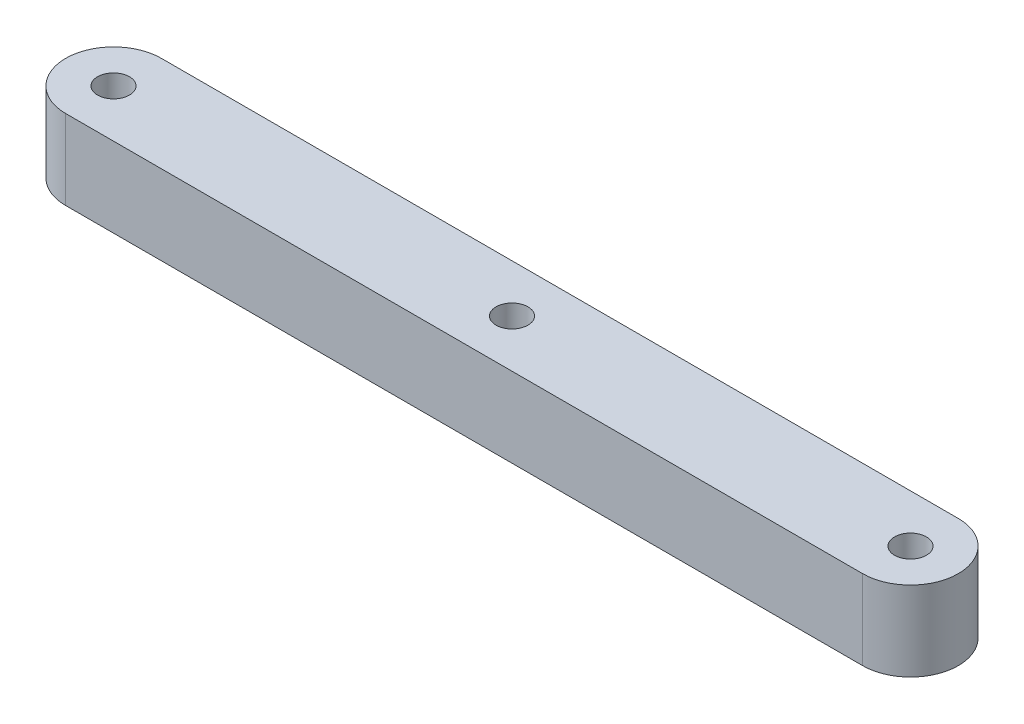
ISO-10303-21;
HEADER;
FILE_DESCRIPTION(('STEP AP214'),'2;1');
FILE_NAME('part.step','',(''),(''),'','','');
FILE_SCHEMA(('AUTOMOTIVE_DESIGN { 1 0 10303 214 1 1 1 1 }'));
ENDSEC;
DATA;
#1=APPLICATION_CONTEXT('core data for automotive mechanical design processes');
#2=APPLICATION_PROTOCOL_DEFINITION('international standard','automotive_design',2000,#1);
#3=PRODUCT_CONTEXT('',#1,'mechanical');
#4=PRODUCT('Part','Part','',(#3));
#5=PRODUCT_RELATED_PRODUCT_CATEGORY('part','',(#4));
#6=PRODUCT_DEFINITION_FORMATION('','',#4);
#7=PRODUCT_DEFINITION_CONTEXT('part definition',#1,'design');
#8=PRODUCT_DEFINITION('design','',#6,#7);
#9=PRODUCT_DEFINITION_SHAPE('','',#8);
#10=(LENGTH_UNIT() NAMED_UNIT(*) SI_UNIT(.MILLI.,.METRE.));
#11=(NAMED_UNIT(*) PLANE_ANGLE_UNIT() SI_UNIT($,.RADIAN.));
#12=(NAMED_UNIT(*) SI_UNIT($,.STERADIAN.) SOLID_ANGLE_UNIT());
#13=UNCERTAINTY_MEASURE_WITH_UNIT(LENGTH_MEASURE(1.E-05),#10,'distance_accuracy_value','');
#14=(GEOMETRIC_REPRESENTATION_CONTEXT(3) GLOBAL_UNCERTAINTY_ASSIGNED_CONTEXT((#13)) GLOBAL_UNIT_ASSIGNED_CONTEXT((#10,
#11,#12)) REPRESENTATION_CONTEXT('',''));
#15=CARTESIAN_POINT('',(0.,0.,0.));
#16=DIRECTION('',(0.,0.,1.));
#17=DIRECTION('',(1.,0.,0.));
#18=AXIS2_PLACEMENT_3D('',#15,#16,#17);
#19=CARTESIAN_POINT('',(-63.5,12.7,0.));
#20=DIRECTION('',(0.,-1.,0.));
#21=DIRECTION('',(0.,0.,-1.));
#22=AXIS2_PLACEMENT_3D('',#19,#20,#21);
#23=CYLINDRICAL_SURFACE('',#22,7.62);
#24=CARTESIAN_POINT('',(-63.5,0.,0.));
#25=DIRECTION('',(0.,1.,0.));
#26=DIRECTION('',(0.,0.,1.));
#27=AXIS2_PLACEMENT_3D('',#24,#25,#26);
#28=CIRCLE('',#27,7.62);
#29=CARTESIAN_POINT('',(-63.5,0.,-7.62));
#30=VERTEX_POINT('',#29);
#31=CARTESIAN_POINT('',(-63.5,0.,7.62));
#32=VERTEX_POINT('',#31);
#33=EDGE_CURVE('E102',#30,#32,#28,.T.);
#34=ORIENTED_EDGE('',*,*,#33,.T.);
#35=DIRECTION('',(0.,-1.,0.));
#36=VECTOR('',#35,1.);
#37=CARTESIAN_POINT('',(-63.5,12.7,7.62));
#38=LINE('',#37,#36);
#39=CARTESIAN_POINT('',(-63.5,12.7,7.62));
#40=VERTEX_POINT('',#39);
#41=EDGE_CURVE('E11',#40,#32,#38,.T.);
#42=ORIENTED_EDGE('',*,*,#41,.F.);
#43=CARTESIAN_POINT('',(-63.5,12.7,0.));
#44=DIRECTION('',(0.,1.,0.));
#45=DIRECTION('',(0.,0.,1.));
#46=AXIS2_PLACEMENT_3D('',#43,#44,#45);
#47=CIRCLE('',#46,7.62);
#48=CARTESIAN_POINT('',(-63.5,12.7,-7.62));
#49=VERTEX_POINT('',#48);
#50=EDGE_CURVE('E90',#49,#40,#47,.T.);
#51=ORIENTED_EDGE('',*,*,#50,.F.);
#52=DIRECTION('',(0.,-1.,0.));
#53=VECTOR('',#52,1.);
#54=CARTESIAN_POINT('',(-63.5,12.7,-7.62));
#55=LINE('',#54,#53);
#56=EDGE_CURVE('E98',#49,#30,#55,.T.);
#57=ORIENTED_EDGE('',*,*,#56,.T.);
#58=EDGE_LOOP('',(#34,#42,#51,#57));
#59=FACE_BOUND('',#58,.T.);
#60=ADVANCED_FACE('F39',(#59),#23,.T.);
#61=CARTESIAN_POINT('',(-63.5,12.7,7.62));
#62=DIRECTION('',(0.,0.,-1.));
#63=DIRECTION('',(-1.,0.,0.));
#64=AXIS2_PLACEMENT_3D('',#61,#62,#63);
#65=PLANE('',#64);
#66=DIRECTION('',(1.,0.,0.));
#67=VECTOR('',#66,1.);
#68=CARTESIAN_POINT('',(-63.5,0.,7.62));
#69=LINE('',#68,#67);
#70=CARTESIAN_POINT('',(63.5,0.,7.62));
#71=VERTEX_POINT('',#70);
#72=EDGE_CURVE('E94',#32,#71,#69,.T.);
#73=ORIENTED_EDGE('',*,*,#72,.T.);
#74=DIRECTION('',(0.,-1.,0.));
#75=VECTOR('',#74,1.);
#76=CARTESIAN_POINT('',(63.5,12.7,7.62));
#77=LINE('',#76,#75);
#78=CARTESIAN_POINT('',(63.5,12.7,7.62));
#79=VERTEX_POINT('',#78);
#80=EDGE_CURVE('E47',#79,#71,#77,.T.);
#81=ORIENTED_EDGE('',*,*,#80,.F.);
#82=DIRECTION('',(1.,0.,0.));
#83=VECTOR('',#82,1.);
#84=CARTESIAN_POINT('',(-63.5,12.7,7.62));
#85=LINE('',#84,#83);
#86=EDGE_CURVE('E85',#40,#79,#85,.T.);
#87=ORIENTED_EDGE('',*,*,#86,.F.);
#88=ORIENTED_EDGE('',*,*,#41,.T.);
#89=EDGE_LOOP('',(#73,#81,#87,#88));
#90=FACE_BOUND('',#89,.T.);
#91=ADVANCED_FACE('F93',(#90),#65,.F.);
#92=CARTESIAN_POINT('',(63.5,12.7,0.));
#93=DIRECTION('',(0.,-1.,0.));
#94=DIRECTION('',(0.,0.,-1.));
#95=AXIS2_PLACEMENT_3D('',#92,#93,#94);
#96=CYLINDRICAL_SURFACE('',#95,7.62);
#97=CARTESIAN_POINT('',(63.5,0.,0.));
#98=DIRECTION('',(0.,1.,0.));
#99=DIRECTION('',(0.,0.,1.));
#100=AXIS2_PLACEMENT_3D('',#97,#98,#99);
#101=CIRCLE('',#100,7.62);
#102=CARTESIAN_POINT('',(63.5,0.,-7.62));
#103=VERTEX_POINT('',#102);
#104=EDGE_CURVE('E72',#71,#103,#101,.T.);
#105=ORIENTED_EDGE('',*,*,#104,.T.);
#106=DIRECTION('',(0.,-1.,0.));
#107=VECTOR('',#106,1.);
#108=CARTESIAN_POINT('',(63.5,12.7,-7.62));
#109=LINE('',#108,#107);
#110=CARTESIAN_POINT('',(63.5,12.7,-7.62));
#111=VERTEX_POINT('',#110);
#112=EDGE_CURVE('E95',#111,#103,#109,.T.);
#113=ORIENTED_EDGE('',*,*,#112,.F.);
#114=CARTESIAN_POINT('',(63.5,12.7,0.));
#115=DIRECTION('',(0.,1.,0.));
#116=DIRECTION('',(0.,0.,1.));
#117=AXIS2_PLACEMENT_3D('',#114,#115,#116);
#118=CIRCLE('',#117,7.62);
#119=EDGE_CURVE('E88',#79,#111,#118,.T.);
#120=ORIENTED_EDGE('',*,*,#119,.F.);
#121=ORIENTED_EDGE('',*,*,#80,.T.);
#122=EDGE_LOOP('',(#105,#113,#120,#121));
#123=FACE_BOUND('',#122,.T.);
#124=ADVANCED_FACE('F96',(#123),#96,.T.);
#125=CARTESIAN_POINT('',(-63.5,12.7,-7.62));
#126=DIRECTION('',(0.,0.,1.));
#127=DIRECTION('',(1.,0.,0.));
#128=AXIS2_PLACEMENT_3D('',#125,#126,#127);
#129=PLANE('',#128);
#130=DIRECTION('',(-1.,0.,0.));
#131=VECTOR('',#130,1.);
#132=CARTESIAN_POINT('',(-63.5,0.,-7.62));
#133=LINE('',#132,#131);
#134=EDGE_CURVE('E78',#103,#30,#133,.T.);
#135=ORIENTED_EDGE('',*,*,#134,.T.);
#136=ORIENTED_EDGE('',*,*,#56,.F.);
#137=DIRECTION('',(-1.,0.,0.));
#138=VECTOR('',#137,1.);
#139=CARTESIAN_POINT('',(-63.5,12.7,-7.62));
#140=LINE('',#139,#138);
#141=EDGE_CURVE('E55',#111,#49,#140,.T.);
#142=ORIENTED_EDGE('',*,*,#141,.F.);
#143=ORIENTED_EDGE('',*,*,#112,.T.);
#144=EDGE_LOOP('',(#135,#136,#142,#143));
#145=FACE_BOUND('',#144,.T.);
#146=ADVANCED_FACE('F110',(#145),#129,.F.);
#147=CARTESIAN_POINT('',(-63.5,12.7,0.));
#148=DIRECTION('',(0.,1.,0.));
#149=DIRECTION('',(0.,0.,1.));
#150=AXIS2_PLACEMENT_3D('',#147,#148,#149);
#151=PLANE('',#150);
#152=CARTESIAN_POINT('',(-63.5,12.7,0.));
#153=DIRECTION('',(0.,1.,0.));
#154=DIRECTION('',(0.,0.,1.));
#155=AXIS2_PLACEMENT_3D('',#152,#153,#154);
#156=CIRCLE('',#155,2.54);
#157=CARTESIAN_POINT('',(-63.5,12.7,2.54));
#158=VERTEX_POINT('',#157);
#159=EDGE_CURVE('E128',#158,#158,#156,.T.);
#160=ORIENTED_EDGE('',*,*,#159,.F.);
#161=EDGE_LOOP('',(#160));
#162=FACE_BOUND('',#161,.T.);
#163=CARTESIAN_POINT('',(63.5,12.7,0.));
#164=DIRECTION('',(0.,1.,0.));
#165=DIRECTION('',(0.,0.,-1.));
#166=AXIS2_PLACEMENT_3D('',#163,#164,#165);
#167=CIRCLE('',#166,2.54);
#168=CARTESIAN_POINT('',(63.5,12.7,-2.54));
#169=VERTEX_POINT('',#168);
#170=EDGE_CURVE('E125',#169,#169,#167,.T.);
#171=ORIENTED_EDGE('',*,*,#170,.F.);
#172=EDGE_LOOP('',(#171));
#173=FACE_BOUND('',#172,.T.);
#174=CARTESIAN_POINT('',(0.,12.7,0.));
#175=DIRECTION('',(0.,1.,0.));
#176=DIRECTION('',(0.,0.,1.));
#177=AXIS2_PLACEMENT_3D('',#174,#175,#176);
#178=CIRCLE('',#177,2.54);
#179=CARTESIAN_POINT('',(0.,12.7,2.54));
#180=VERTEX_POINT('',#179);
#181=EDGE_CURVE('E119',#180,#180,#178,.T.);
#182=ORIENTED_EDGE('',*,*,#181,.F.);
#183=EDGE_LOOP('',(#182));
#184=FACE_BOUND('',#183,.T.);
#185=ORIENTED_EDGE('',*,*,#50,.T.);
#186=ORIENTED_EDGE('',*,*,#86,.T.);
#187=ORIENTED_EDGE('',*,*,#119,.T.);
#188=ORIENTED_EDGE('',*,*,#141,.T.);
#189=EDGE_LOOP('',(#185,#186,#187,#188));
#190=FACE_BOUND('',#189,.T.);
#191=ADVANCED_FACE('F86',(#162,#173,#184,#190),#151,.T.);
#192=CARTESIAN_POINT('',(-63.5,0.,0.));
#193=DIRECTION('',(0.,1.,0.));
#194=DIRECTION('',(0.,0.,1.));
#195=AXIS2_PLACEMENT_3D('',#192,#193,#194);
#196=PLANE('',#195);
#197=CARTESIAN_POINT('',(-63.5,0.,0.));
#198=DIRECTION('',(0.,1.,0.));
#199=DIRECTION('',(0.,0.,1.));
#200=AXIS2_PLACEMENT_3D('',#197,#198,#199);
#201=CIRCLE('',#200,2.54);
#202=CARTESIAN_POINT('',(-63.5,0.,2.54));
#203=VERTEX_POINT('',#202);
#204=EDGE_CURVE('E105',#203,#203,#201,.T.);
#205=ORIENTED_EDGE('',*,*,#204,.T.);
#206=EDGE_LOOP('',(#205));
#207=FACE_BOUND('',#206,.T.);
#208=CARTESIAN_POINT('',(63.5,0.,0.));
#209=DIRECTION('',(0.,1.,0.));
#210=DIRECTION('',(0.,0.,-1.));
#211=AXIS2_PLACEMENT_3D('',#208,#209,#210);
#212=CIRCLE('',#211,2.54);
#213=CARTESIAN_POINT('',(63.5,0.,-2.54));
#214=VERTEX_POINT('',#213);
#215=EDGE_CURVE('E122',#214,#214,#212,.T.);
#216=ORIENTED_EDGE('',*,*,#215,.T.);
#217=EDGE_LOOP('',(#216));
#218=FACE_BOUND('',#217,.T.);
#219=CARTESIAN_POINT('',(0.,0.,0.));
#220=DIRECTION('',(0.,1.,0.));
#221=DIRECTION('',(0.,0.,1.));
#222=AXIS2_PLACEMENT_3D('',#219,#220,#221);
#223=CIRCLE('',#222,2.54);
#224=CARTESIAN_POINT('',(0.,0.,2.54));
#225=VERTEX_POINT('',#224);
#226=EDGE_CURVE('E116',#225,#225,#223,.T.);
#227=ORIENTED_EDGE('',*,*,#226,.T.);
#228=EDGE_LOOP('',(#227));
#229=FACE_BOUND('',#228,.T.);
#230=ORIENTED_EDGE('',*,*,#33,.F.);
#231=ORIENTED_EDGE('',*,*,#134,.F.);
#232=ORIENTED_EDGE('',*,*,#104,.F.);
#233=ORIENTED_EDGE('',*,*,#72,.F.);
#234=EDGE_LOOP('',(#230,#231,#232,#233));
#235=FACE_BOUND('',#234,.T.);
#236=ADVANCED_FACE('F113',(#207,#218,#229,#235),#196,.F.);
#237=CARTESIAN_POINT('',(0.,0.,0.));
#238=DIRECTION('',(0.,1.,0.));
#239=DIRECTION('',(0.,0.,1.));
#240=AXIS2_PLACEMENT_3D('',#237,#238,#239);
#241=CYLINDRICAL_SURFACE('',#240,2.54);
#242=ORIENTED_EDGE('',*,*,#226,.F.);
#243=EDGE_LOOP('',(#242));
#244=FACE_BOUND('',#243,.T.);
#245=ORIENTED_EDGE('',*,*,#181,.T.);
#246=EDGE_LOOP('',(#245));
#247=FACE_BOUND('',#246,.T.);
#248=ADVANCED_FACE('F150',(#244,#247),#241,.F.);
#249=CARTESIAN_POINT('',(63.5,0.,0.));
#250=DIRECTION('',(0.,1.,0.));
#251=DIRECTION('',(0.,0.,1.));
#252=AXIS2_PLACEMENT_3D('',#249,#250,#251);
#253=CYLINDRICAL_SURFACE('',#252,2.54);
#254=ORIENTED_EDGE('',*,*,#215,.F.);
#255=EDGE_LOOP('',(#254));
#256=FACE_BOUND('',#255,.T.);
#257=ORIENTED_EDGE('',*,*,#170,.T.);
#258=EDGE_LOOP('',(#257));
#259=FACE_BOUND('',#258,.T.);
#260=ADVANCED_FACE('F139',(#256,#259),#253,.F.);
#261=CARTESIAN_POINT('',(-63.5,0.,0.));
#262=DIRECTION('',(0.,1.,0.));
#263=DIRECTION('',(0.,0.,1.));
#264=AXIS2_PLACEMENT_3D('',#261,#262,#263);
#265=CYLINDRICAL_SURFACE('',#264,2.54);
#266=ORIENTED_EDGE('',*,*,#204,.F.);
#267=EDGE_LOOP('',(#266));
#268=FACE_BOUND('',#267,.T.);
#269=ORIENTED_EDGE('',*,*,#159,.T.);
#270=EDGE_LOOP('',(#269));
#271=FACE_BOUND('',#270,.T.);
#272=ADVANCED_FACE('F136',(#268,#271),#265,.F.);
#273=CLOSED_SHELL('',(#60,#91,#124,#146,#191,#236,#248,#260,#272));
#274=MANIFOLD_SOLID_BREP('B2',#273);
#275=ADVANCED_BREP_SHAPE_REPRESENTATION('',(#18,#274),#14);
#276=SHAPE_DEFINITION_REPRESENTATION(#9,#275);
ENDSEC;
END-ISO-10303-21;
